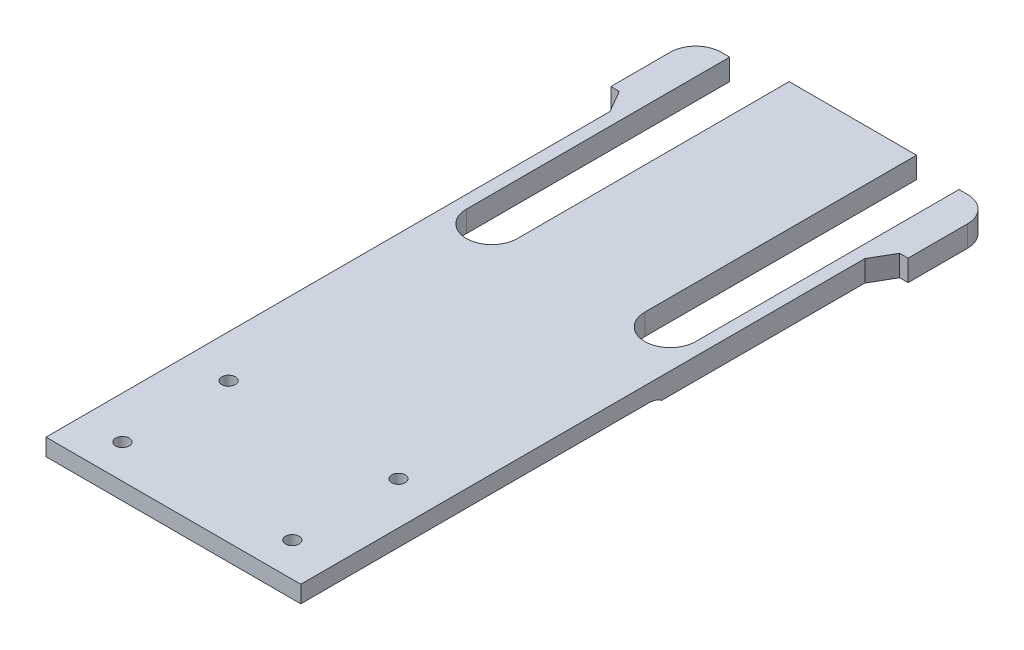
ISO-10303-21;
HEADER;
FILE_DESCRIPTION(('STEP AP214'),'2;1');
FILE_NAME('part.step','',(''),(''),'','','');
FILE_SCHEMA(('AUTOMOTIVE_DESIGN { 1 0 10303 214 1 1 1 1 }'));
ENDSEC;
DATA;
#1=APPLICATION_CONTEXT('core data for automotive mechanical design processes');
#2=APPLICATION_PROTOCOL_DEFINITION('international standard','automotive_design',2000,#1);
#3=PRODUCT_CONTEXT('',#1,'mechanical');
#4=PRODUCT('Part','Part','',(#3));
#5=PRODUCT_RELATED_PRODUCT_CATEGORY('part','',(#4));
#6=PRODUCT_DEFINITION_FORMATION('','',#4);
#7=PRODUCT_DEFINITION_CONTEXT('part definition',#1,'design');
#8=PRODUCT_DEFINITION('design','',#6,#7);
#9=PRODUCT_DEFINITION_SHAPE('','',#8);
#10=(LENGTH_UNIT() NAMED_UNIT(*) SI_UNIT(.MILLI.,.METRE.));
#11=(NAMED_UNIT(*) PLANE_ANGLE_UNIT() SI_UNIT($,.RADIAN.));
#12=(NAMED_UNIT(*) SI_UNIT($,.STERADIAN.) SOLID_ANGLE_UNIT());
#13=UNCERTAINTY_MEASURE_WITH_UNIT(LENGTH_MEASURE(1.E-05),#10,'distance_accuracy_value','');
#14=(GEOMETRIC_REPRESENTATION_CONTEXT(3) GLOBAL_UNCERTAINTY_ASSIGNED_CONTEXT((#13)) GLOBAL_UNIT_ASSIGNED_CONTEXT((#10,
#11,#12)) REPRESENTATION_CONTEXT('',''));
#15=CARTESIAN_POINT('',(0.,0.,0.));
#16=DIRECTION('',(0.,0.,1.));
#17=DIRECTION('',(1.,0.,0.));
#18=AXIS2_PLACEMENT_3D('',#15,#16,#17);
#19=CARTESIAN_POINT('',(30.,5.,22.));
#20=DIRECTION('',(-1.,0.,0.));
#21=DIRECTION('',(0.,0.,1.));
#22=AXIS2_PLACEMENT_3D('',#19,#20,#21);
#23=PLANE('',#22);
#24=DIRECTION('',(0.,0.,1.));
#25=VECTOR('',#24,1.);
#26=CARTESIAN_POINT('',(30.0000000000001,1.,160.));
#27=LINE('',#26,#25);
#28=CARTESIAN_POINT('',(30.,0.99999999999999,78.));
#29=VERTEX_POINT('',#28);
#30=CARTESIAN_POINT('',(30.0000000000001,1.,160.));
#31=VERTEX_POINT('',#30);
#32=EDGE_CURVE('E203',#29,#31,#27,.T.);
#33=ORIENTED_EDGE('',*,*,#32,.F.);
#34=CARTESIAN_POINT('',(30.,-4.00000000000001,78.));
#35=DIRECTION('',(-1.,0.,0.));
#36=DIRECTION('',(0.,0.,1.));
#37=AXIS2_PLACEMENT_3D('',#34,#35,#36);
#38=CIRCLE('',#37,5.);
#39=CARTESIAN_POINT('',(30.,0.,75.));
#40=VERTEX_POINT('',#39);
#41=EDGE_CURVE('E11',#29,#40,#38,.T.);
#42=ORIENTED_EDGE('',*,*,#41,.T.);
#43=DIRECTION('',(0.,0.,-1.));
#44=VECTOR('',#43,1.);
#45=CARTESIAN_POINT('',(30.,0.,22.));
#46=LINE('',#45,#44);
#47=CARTESIAN_POINT('',(30.,0.,27.1961524227067));
#48=VERTEX_POINT('',#47);
#49=EDGE_CURVE('E335',#40,#48,#46,.T.);
#50=ORIENTED_EDGE('',*,*,#49,.T.);
#51=DIRECTION('',(0.,1.,0.));
#52=VECTOR('',#51,1.);
#53=CARTESIAN_POINT('',(30.,5.,27.1961524227067));
#54=LINE('',#53,#52);
#55=CARTESIAN_POINT('',(30.,5.,27.1961524227067));
#56=VERTEX_POINT('',#55);
#57=EDGE_CURVE('E357',#48,#56,#54,.T.);
#58=ORIENTED_EDGE('',*,*,#57,.T.);
#59=DIRECTION('',(0.,0.,-1.));
#60=VECTOR('',#59,1.);
#61=CARTESIAN_POINT('',(30.,5.,22.));
#62=LINE('',#61,#60);
#63=CARTESIAN_POINT('',(30.0000000000001,5.,160.));
#64=VERTEX_POINT('',#63);
#65=EDGE_CURVE('E229',#64,#56,#62,.T.);
#66=ORIENTED_EDGE('',*,*,#65,.F.);
#67=DIRECTION('',(0.,-1.,0.));
#68=VECTOR('',#67,1.);
#69=CARTESIAN_POINT('',(30.0000000000001,5.,160.));
#70=LINE('',#69,#68);
#71=EDGE_CURVE('E220',#64,#31,#70,.T.);
#72=ORIENTED_EDGE('',*,*,#71,.T.);
#73=EDGE_LOOP('',(#33,#42,#50,#58,#66,#72));
#74=FACE_BOUND('',#73,.T.);
#75=ADVANCED_FACE('F45',(#74),#23,.F.);
#76=CARTESIAN_POINT('',(35.,5.,22.));
#77=DIRECTION('',(0.,0.,-1.));
#78=DIRECTION('',(-1.,0.,0.));
#79=AXIS2_PLACEMENT_3D('',#76,#77,#78);
#80=PLANE('',#79);
#81=DIRECTION('',(1.,0.,0.));
#82=VECTOR('',#81,1.);
#83=CARTESIAN_POINT('',(35.,5.,22.));
#84=LINE('',#83,#82);
#85=CARTESIAN_POINT('',(33.,5.,22.));
#86=VERTEX_POINT('',#85);
#87=CARTESIAN_POINT('',(35.,5.,22.));
#88=VERTEX_POINT('',#87);
#89=EDGE_CURVE('E375',#86,#88,#84,.T.);
#90=ORIENTED_EDGE('',*,*,#89,.F.);
#91=DIRECTION('',(0.,-1.,0.));
#92=VECTOR('',#91,1.);
#93=CARTESIAN_POINT('',(33.,0.,22.));
#94=LINE('',#93,#92);
#95=CARTESIAN_POINT('',(33.,0.,22.));
#96=VERTEX_POINT('',#95);
#97=EDGE_CURVE('E353',#86,#96,#94,.T.);
#98=ORIENTED_EDGE('',*,*,#97,.T.);
#99=DIRECTION('',(1.,0.,0.));
#100=VECTOR('',#99,1.);
#101=CARTESIAN_POINT('',(35.,0.,22.));
#102=LINE('',#101,#100);
#103=CARTESIAN_POINT('',(35.,0.,22.));
#104=VERTEX_POINT('',#103);
#105=EDGE_CURVE('E394',#96,#104,#102,.T.);
#106=ORIENTED_EDGE('',*,*,#105,.T.);
#107=DIRECTION('',(0.,-1.,0.));
#108=VECTOR('',#107,1.);
#109=CARTESIAN_POINT('',(35.,5.,22.));
#110=LINE('',#109,#108);
#111=EDGE_CURVE('E262',#88,#104,#110,.T.);
#112=ORIENTED_EDGE('',*,*,#111,.F.);
#113=EDGE_LOOP('',(#90,#98,#106,#112));
#114=FACE_BOUND('',#113,.T.);
#115=ADVANCED_FACE('F381',(#114),#80,.F.);
#116=CARTESIAN_POINT('',(35.,5.,1.99999999999998));
#117=DIRECTION('',(-1.,0.,0.));
#118=DIRECTION('',(0.,0.,1.));
#119=AXIS2_PLACEMENT_3D('',#116,#117,#118);
#120=PLANE('',#119);
#121=DIRECTION('',(0.,0.,-1.));
#122=VECTOR('',#121,1.);
#123=CARTESIAN_POINT('',(35.,0.,1.99999999999998));
#124=LINE('',#123,#122);
#125=CARTESIAN_POINT('',(35.,0.,7.99999999999999));
#126=VERTEX_POINT('',#125);
#127=EDGE_CURVE('E396',#104,#126,#124,.T.);
#128=ORIENTED_EDGE('',*,*,#127,.T.);
#129=DIRECTION('',(0.,-1.,0.));
#130=VECTOR('',#129,1.);
#131=CARTESIAN_POINT('',(35.,5.,7.99999999999999));
#132=LINE('',#131,#130);
#133=CARTESIAN_POINT('',(35.,5.,7.99999999999999));
#134=VERTEX_POINT('',#133);
#135=EDGE_CURVE('E289',#126,#134,#132,.F.);
#136=ORIENTED_EDGE('',*,*,#135,.T.);
#137=DIRECTION('',(0.,0.,-1.));
#138=VECTOR('',#137,1.);
#139=CARTESIAN_POINT('',(35.,5.,1.99999999999998));
#140=LINE('',#139,#138);
#141=EDGE_CURVE('E385',#88,#134,#140,.T.);
#142=ORIENTED_EDGE('',*,*,#141,.F.);
#143=ORIENTED_EDGE('',*,*,#111,.T.);
#144=EDGE_LOOP('',(#128,#136,#142,#143));
#145=FACE_BOUND('',#144,.T.);
#146=ADVANCED_FACE('F542',(#145),#120,.F.);
#147=CARTESIAN_POINT('',(27.,5.,1.99999999999999));
#148=DIRECTION('',(0.,0.,1.));
#149=DIRECTION('',(1.,0.,0.));
#150=AXIS2_PLACEMENT_3D('',#147,#148,#149);
#151=PLANE('',#150);
#152=DIRECTION('',(-1.,0.,0.));
#153=VECTOR('',#152,1.);
#154=CARTESIAN_POINT('',(27.,5.,1.99999999999999));
#155=LINE('',#154,#153);
#156=CARTESIAN_POINT('',(29.,5.,1.99999999999999));
#157=VERTEX_POINT('',#156);
#158=CARTESIAN_POINT('',(27.,5.,1.99999999999999));
#159=VERTEX_POINT('',#158);
#160=EDGE_CURVE('E445',#157,#159,#155,.T.);
#161=ORIENTED_EDGE('',*,*,#160,.F.);
#162=DIRECTION('',(0.,-1.,0.));
#163=VECTOR('',#162,1.);
#164=CARTESIAN_POINT('',(29.,5.,1.99999999999999));
#165=LINE('',#164,#163);
#166=CARTESIAN_POINT('',(29.,0.,1.99999999999999));
#167=VERTEX_POINT('',#166);
#168=EDGE_CURVE('E285',#157,#167,#165,.T.);
#169=ORIENTED_EDGE('',*,*,#168,.T.);
#170=DIRECTION('',(-1.,0.,0.));
#171=VECTOR('',#170,1.);
#172=CARTESIAN_POINT('',(27.,0.,1.99999999999999));
#173=LINE('',#172,#171);
#174=CARTESIAN_POINT('',(27.,0.,1.99999999999999));
#175=VERTEX_POINT('',#174);
#176=EDGE_CURVE('E401',#167,#175,#173,.T.);
#177=ORIENTED_EDGE('',*,*,#176,.T.);
#178=DIRECTION('',(0.,-1.,0.));
#179=VECTOR('',#178,1.);
#180=CARTESIAN_POINT('',(27.,5.,1.99999999999999));
#181=LINE('',#180,#179);
#182=EDGE_CURVE('E258',#159,#175,#181,.T.);
#183=ORIENTED_EDGE('',*,*,#182,.F.);
#184=EDGE_LOOP('',(#161,#169,#177,#183));
#185=FACE_BOUND('',#184,.T.);
#186=ADVANCED_FACE('F802',(#185),#151,.F.);
#187=CARTESIAN_POINT('',(27.,5.,70.));
#188=DIRECTION('',(1.,0.,0.));
#189=DIRECTION('',(0.,0.,-1.));
#190=AXIS2_PLACEMENT_3D('',#187,#188,#189);
#191=PLANE('',#190);
#192=DIRECTION('',(0.,0.,1.));
#193=VECTOR('',#192,1.);
#194=CARTESIAN_POINT('',(27.,0.,70.));
#195=LINE('',#194,#193);
#196=CARTESIAN_POINT('',(27.,0.,64.));
#197=VERTEX_POINT('',#196);
#198=EDGE_CURVE('E407',#175,#197,#195,.T.);
#199=ORIENTED_EDGE('',*,*,#198,.T.);
#200=DIRECTION('',(0.,-1.,0.));
#201=VECTOR('',#200,1.);
#202=CARTESIAN_POINT('',(27.,5.,64.));
#203=LINE('',#202,#201);
#204=CARTESIAN_POINT('',(27.,5.,64.));
#205=VERTEX_POINT('',#204);
#206=EDGE_CURVE('E303',#197,#205,#203,.F.);
#207=ORIENTED_EDGE('',*,*,#206,.T.);
#208=DIRECTION('',(0.,0.,1.));
#209=VECTOR('',#208,1.);
#210=CARTESIAN_POINT('',(27.,5.,70.));
#211=LINE('',#210,#209);
#212=EDGE_CURVE('E448',#159,#205,#211,.T.);
#213=ORIENTED_EDGE('',*,*,#212,.F.);
#214=ORIENTED_EDGE('',*,*,#182,.T.);
#215=EDGE_LOOP('',(#199,#207,#213,#214));
#216=FACE_BOUND('',#215,.T.);
#217=ADVANCED_FACE('F792',(#216),#191,.F.);
#218=CARTESIAN_POINT('',(15.,5.,0.));
#219=DIRECTION('',(-1.,0.,0.));
#220=DIRECTION('',(0.,0.,1.));
#221=AXIS2_PLACEMENT_3D('',#218,#219,#220);
#222=PLANE('',#221);
#223=DIRECTION('',(0.,0.,-1.));
#224=VECTOR('',#223,1.);
#225=CARTESIAN_POINT('',(15.,5.,0.));
#226=LINE('',#225,#224);
#227=CARTESIAN_POINT('',(15.,5.,64.));
#228=VERTEX_POINT('',#227);
#229=CARTESIAN_POINT('',(15.,5.,0.));
#230=VERTEX_POINT('',#229);
#231=EDGE_CURVE('E452',#228,#230,#226,.T.);
#232=ORIENTED_EDGE('',*,*,#231,.F.);
#233=DIRECTION('',(0.,-1.,0.));
#234=VECTOR('',#233,1.);
#235=CARTESIAN_POINT('',(15.,0.,64.));
#236=LINE('',#235,#234);
#237=CARTESIAN_POINT('',(15.,0.,64.));
#238=VERTEX_POINT('',#237);
#239=EDGE_CURVE('E299',#228,#238,#236,.T.);
#240=ORIENTED_EDGE('',*,*,#239,.T.);
#241=DIRECTION('',(0.,0.,-1.));
#242=VECTOR('',#241,1.);
#243=CARTESIAN_POINT('',(15.,0.,0.));
#244=LINE('',#243,#242);
#245=CARTESIAN_POINT('',(15.,0.,0.));
#246=VERTEX_POINT('',#245);
#247=EDGE_CURVE('E411',#238,#246,#244,.T.);
#248=ORIENTED_EDGE('',*,*,#247,.T.);
#249=DIRECTION('',(0.,-1.,0.));
#250=VECTOR('',#249,1.);
#251=CARTESIAN_POINT('',(15.,5.,0.));
#252=LINE('',#251,#250);
#253=EDGE_CURVE('E254',#230,#246,#252,.T.);
#254=ORIENTED_EDGE('',*,*,#253,.F.);
#255=EDGE_LOOP('',(#232,#240,#248,#254));
#256=FACE_BOUND('',#255,.T.);
#257=ADVANCED_FACE('F782',(#256),#222,.F.);
#258=CARTESIAN_POINT('',(15.,5.,0.));
#259=DIRECTION('',(0.,0.,1.));
#260=DIRECTION('',(1.,0.,0.));
#261=AXIS2_PLACEMENT_3D('',#258,#259,#260);
#262=PLANE('',#261);
#263=DIRECTION('',(-1.,0.,0.));
#264=VECTOR('',#263,1.);
#265=CARTESIAN_POINT('',(15.,0.,0.));
#266=LINE('',#265,#264);
#267=CARTESIAN_POINT('',(-15.,0.,0.));
#268=VERTEX_POINT('',#267);
#269=EDGE_CURVE('E414',#246,#268,#266,.T.);
#270=ORIENTED_EDGE('',*,*,#269,.T.);
#271=DIRECTION('',(0.,-1.,0.));
#272=VECTOR('',#271,1.);
#273=CARTESIAN_POINT('',(-15.,5.,0.));
#274=LINE('',#273,#272);
#275=CARTESIAN_POINT('',(-15.,5.,0.));
#276=VERTEX_POINT('',#275);
#277=EDGE_CURVE('E250',#276,#268,#274,.T.);
#278=ORIENTED_EDGE('',*,*,#277,.F.);
#279=DIRECTION('',(-1.,0.,0.));
#280=VECTOR('',#279,1.);
#281=CARTESIAN_POINT('',(15.,5.,0.));
#282=LINE('',#281,#280);
#283=EDGE_CURVE('E455',#230,#276,#282,.T.);
#284=ORIENTED_EDGE('',*,*,#283,.F.);
#285=ORIENTED_EDGE('',*,*,#253,.T.);
#286=EDGE_LOOP('',(#270,#278,#284,#285));
#287=FACE_BOUND('',#286,.T.);
#288=ADVANCED_FACE('F772',(#287),#262,.F.);
#289=CARTESIAN_POINT('',(-15.,5.,0.));
#290=DIRECTION('',(1.,0.,0.));
#291=DIRECTION('',(0.,0.,-1.));
#292=AXIS2_PLACEMENT_3D('',#289,#290,#291);
#293=PLANE('',#292);
#294=DIRECTION('',(0.,0.,1.));
#295=VECTOR('',#294,1.);
#296=CARTESIAN_POINT('',(-15.,0.,0.));
#297=LINE('',#296,#295);
#298=CARTESIAN_POINT('',(-15.,0.,64.));
#299=VERTEX_POINT('',#298);
#300=EDGE_CURVE('E417',#268,#299,#297,.T.);
#301=ORIENTED_EDGE('',*,*,#300,.T.);
#302=DIRECTION('',(0.,-1.,0.));
#303=VECTOR('',#302,1.);
#304=CARTESIAN_POINT('',(-15.,5.,64.));
#305=LINE('',#304,#303);
#306=CARTESIAN_POINT('',(-15.,5.,64.));
#307=VERTEX_POINT('',#306);
#308=EDGE_CURVE('E296',#299,#307,#305,.F.);
#309=ORIENTED_EDGE('',*,*,#308,.T.);
#310=DIRECTION('',(0.,0.,1.));
#311=VECTOR('',#310,1.);
#312=CARTESIAN_POINT('',(-15.,5.,0.));
#313=LINE('',#312,#311);
#314=EDGE_CURVE('E458',#276,#307,#313,.T.);
#315=ORIENTED_EDGE('',*,*,#314,.F.);
#316=ORIENTED_EDGE('',*,*,#277,.T.);
#317=EDGE_LOOP('',(#301,#309,#315,#316));
#318=FACE_BOUND('',#317,.T.);
#319=ADVANCED_FACE('F762',(#318),#293,.F.);
#320=CARTESIAN_POINT('',(-27.,5.,70.));
#321=DIRECTION('',(-1.,0.,0.));
#322=DIRECTION('',(0.,0.,1.));
#323=AXIS2_PLACEMENT_3D('',#320,#321,#322);
#324=PLANE('',#323);
#325=DIRECTION('',(0.,0.,-1.));
#326=VECTOR('',#325,1.);
#327=CARTESIAN_POINT('',(-27.,5.,70.));
#328=LINE('',#327,#326);
#329=CARTESIAN_POINT('',(-27.,5.,64.));
#330=VERTEX_POINT('',#329);
#331=CARTESIAN_POINT('',(-27.,5.,1.99999999999999));
#332=VERTEX_POINT('',#331);
#333=EDGE_CURVE('E462',#330,#332,#328,.T.);
#334=ORIENTED_EDGE('',*,*,#333,.F.);
#335=DIRECTION('',(0.,-1.,0.));
#336=VECTOR('',#335,1.);
#337=CARTESIAN_POINT('',(-27.,0.,64.));
#338=LINE('',#337,#336);
#339=CARTESIAN_POINT('',(-27.,0.,64.));
#340=VERTEX_POINT('',#339);
#341=EDGE_CURVE('E292',#330,#340,#338,.T.);
#342=ORIENTED_EDGE('',*,*,#341,.T.);
#343=DIRECTION('',(0.,0.,-1.));
#344=VECTOR('',#343,1.);
#345=CARTESIAN_POINT('',(-27.,0.,70.));
#346=LINE('',#345,#344);
#347=CARTESIAN_POINT('',(-27.,0.,1.99999999999999));
#348=VERTEX_POINT('',#347);
#349=EDGE_CURVE('E421',#340,#348,#346,.T.);
#350=ORIENTED_EDGE('',*,*,#349,.T.);
#351=DIRECTION('',(0.,-1.,0.));
#352=VECTOR('',#351,1.);
#353=CARTESIAN_POINT('',(-27.,5.,1.99999999999999));
#354=LINE('',#353,#352);
#355=EDGE_CURVE('E246',#332,#348,#354,.T.);
#356=ORIENTED_EDGE('',*,*,#355,.F.);
#357=EDGE_LOOP('',(#334,#342,#350,#356));
#358=FACE_BOUND('',#357,.T.);
#359=ADVANCED_FACE('F752',(#358),#324,.F.);
#360=CARTESIAN_POINT('',(-27.,5.,1.99999999999999));
#361=DIRECTION('',(0.,0.,1.));
#362=DIRECTION('',(1.,0.,0.));
#363=AXIS2_PLACEMENT_3D('',#360,#361,#362);
#364=PLANE('',#363);
#365=DIRECTION('',(-1.,0.,0.));
#366=VECTOR('',#365,1.);
#367=CARTESIAN_POINT('',(-27.,0.,1.99999999999999));
#368=LINE('',#367,#366);
#369=CARTESIAN_POINT('',(-29.,0.,1.99999999999999));
#370=VERTEX_POINT('',#369);
#371=EDGE_CURVE('E424',#348,#370,#368,.T.);
#372=ORIENTED_EDGE('',*,*,#371,.T.);
#373=DIRECTION('',(0.,-1.,0.));
#374=VECTOR('',#373,1.);
#375=CARTESIAN_POINT('',(-29.,5.,1.99999999999999));
#376=LINE('',#375,#374);
#377=CARTESIAN_POINT('',(-29.,5.,1.99999999999999));
#378=VERTEX_POINT('',#377);
#379=EDGE_CURVE('E276',#370,#378,#376,.F.);
#380=ORIENTED_EDGE('',*,*,#379,.T.);
#381=DIRECTION('',(-1.,0.,0.));
#382=VECTOR('',#381,1.);
#383=CARTESIAN_POINT('',(-27.,5.,1.99999999999999));
#384=LINE('',#383,#382);
#385=EDGE_CURVE('E465',#332,#378,#384,.T.);
#386=ORIENTED_EDGE('',*,*,#385,.F.);
#387=ORIENTED_EDGE('',*,*,#355,.T.);
#388=EDGE_LOOP('',(#372,#380,#386,#387));
#389=FACE_BOUND('',#388,.T.);
#390=ADVANCED_FACE('F742',(#389),#364,.F.);
#391=CARTESIAN_POINT('',(-35.,5.,1.99999999999999));
#392=DIRECTION('',(1.,0.,0.));
#393=DIRECTION('',(0.,0.,-1.));
#394=AXIS2_PLACEMENT_3D('',#391,#392,#393);
#395=PLANE('',#394);
#396=DIRECTION('',(0.,0.,1.));
#397=VECTOR('',#396,1.);
#398=CARTESIAN_POINT('',(-35.,5.,1.99999999999999));
#399=LINE('',#398,#397);
#400=CARTESIAN_POINT('',(-35.,5.,7.99999999999999));
#401=VERTEX_POINT('',#400);
#402=CARTESIAN_POINT('',(-35.,5.,22.));
#403=VERTEX_POINT('',#402);
#404=EDGE_CURVE('E468',#401,#403,#399,.T.);
#405=ORIENTED_EDGE('',*,*,#404,.F.);
#406=DIRECTION('',(0.,-1.,0.));
#407=VECTOR('',#406,1.);
#408=CARTESIAN_POINT('',(-35.,5.,7.99999999999999));
#409=LINE('',#408,#407);
#410=CARTESIAN_POINT('',(-35.,0.,7.99999999999999));
#411=VERTEX_POINT('',#410);
#412=EDGE_CURVE('E266',#401,#411,#409,.T.);
#413=ORIENTED_EDGE('',*,*,#412,.T.);
#414=DIRECTION('',(0.,0.,1.));
#415=VECTOR('',#414,1.);
#416=CARTESIAN_POINT('',(-35.,0.,1.99999999999999));
#417=LINE('',#416,#415);
#418=CARTESIAN_POINT('',(-35.,0.,22.));
#419=VERTEX_POINT('',#418);
#420=EDGE_CURVE('E428',#411,#419,#417,.T.);
#421=ORIENTED_EDGE('',*,*,#420,.T.);
#422=DIRECTION('',(0.,-1.,0.));
#423=VECTOR('',#422,1.);
#424=CARTESIAN_POINT('',(-35.,5.,22.));
#425=LINE('',#424,#423);
#426=EDGE_CURVE('E235',#403,#419,#425,.T.);
#427=ORIENTED_EDGE('',*,*,#426,.F.);
#428=EDGE_LOOP('',(#405,#413,#421,#427));
#429=FACE_BOUND('',#428,.T.);
#430=ADVANCED_FACE('F733',(#429),#395,.F.);
#431=CARTESIAN_POINT('',(-35.,5.,22.));
#432=DIRECTION('',(0.,0.,-1.));
#433=DIRECTION('',(-1.,0.,0.));
#434=AXIS2_PLACEMENT_3D('',#431,#432,#433);
#435=PLANE('',#434);
#436=DIRECTION('',(1.,0.,0.));
#437=VECTOR('',#436,1.);
#438=CARTESIAN_POINT('',(-35.,0.,22.));
#439=LINE('',#438,#437);
#440=CARTESIAN_POINT('',(-33.,0.,22.));
#441=VERTEX_POINT('',#440);
#442=EDGE_CURVE('E430',#419,#441,#439,.T.);
#443=ORIENTED_EDGE('',*,*,#442,.T.);
#444=DIRECTION('',(0.,1.,0.));
#445=VECTOR('',#444,1.);
#446=CARTESIAN_POINT('',(-33.,5.,22.));
#447=LINE('',#446,#445);
#448=CARTESIAN_POINT('',(-33.,5.,22.));
#449=VERTEX_POINT('',#448);
#450=EDGE_CURVE('E344',#441,#449,#447,.T.);
#451=ORIENTED_EDGE('',*,*,#450,.T.);
#452=DIRECTION('',(1.,0.,0.));
#453=VECTOR('',#452,1.);
#454=CARTESIAN_POINT('',(-35.,5.,22.));
#455=LINE('',#454,#453);
#456=EDGE_CURVE('E471',#403,#449,#455,.T.);
#457=ORIENTED_EDGE('',*,*,#456,.F.);
#458=ORIENTED_EDGE('',*,*,#426,.T.);
#459=EDGE_LOOP('',(#443,#451,#457,#458));
#460=FACE_BOUND('',#459,.T.);
#461=ADVANCED_FACE('F625',(#460),#435,.F.);
#462=CARTESIAN_POINT('',(-30.,5.,22.));
#463=DIRECTION('',(1.,0.,0.));
#464=DIRECTION('',(0.,0.,-1.));
#465=AXIS2_PLACEMENT_3D('',#462,#463,#464);
#466=PLANE('',#465);
#467=DIRECTION('',(0.,0.,1.));
#468=VECTOR('',#467,1.);
#469=CARTESIAN_POINT('',(-30.,0.,22.));
#470=LINE('',#469,#468);
#471=CARTESIAN_POINT('',(-30.,0.,27.1961524227067));
#472=VERTEX_POINT('',#471);
#473=CARTESIAN_POINT('',(-30.,0.,75.));
#474=VERTEX_POINT('',#473);
#475=EDGE_CURVE('E240',#472,#474,#470,.T.);
#476=ORIENTED_EDGE('',*,*,#475,.T.);
#477=CARTESIAN_POINT('',(-30.,-4.00000000000001,78.));
#478=DIRECTION('',(1.,0.,0.));
#479=DIRECTION('',(0.,0.,-1.));
#480=AXIS2_PLACEMENT_3D('',#477,#478,#479);
#481=CIRCLE('',#480,5.);
#482=CARTESIAN_POINT('',(-30.,0.99999999999999,78.));
#483=VERTEX_POINT('',#482);
#484=EDGE_CURVE('E54',#474,#483,#481,.T.);
#485=ORIENTED_EDGE('',*,*,#484,.T.);
#486=DIRECTION('',(0.,0.,-1.));
#487=VECTOR('',#486,1.);
#488=CARTESIAN_POINT('',(-30.,1.,160.));
#489=LINE('',#488,#487);
#490=CARTESIAN_POINT('',(-30.,1.,160.));
#491=VERTEX_POINT('',#490);
#492=EDGE_CURVE('E226',#491,#483,#489,.T.);
#493=ORIENTED_EDGE('',*,*,#492,.F.);
#494=DIRECTION('',(0.,-1.,0.));
#495=VECTOR('',#494,1.);
#496=CARTESIAN_POINT('',(-30.,5.,160.));
#497=LINE('',#496,#495);
#498=CARTESIAN_POINT('',(-30.,5.,160.));
#499=VERTEX_POINT('',#498);
#500=EDGE_CURVE('E223',#499,#491,#497,.T.);
#501=ORIENTED_EDGE('',*,*,#500,.F.);
#502=DIRECTION('',(0.,0.,1.));
#503=VECTOR('',#502,1.);
#504=CARTESIAN_POINT('',(-30.,5.,22.));
#505=LINE('',#504,#503);
#506=CARTESIAN_POINT('',(-30.,5.,27.1961524227067));
#507=VERTEX_POINT('',#506);
#508=EDGE_CURVE('E237',#507,#499,#505,.T.);
#509=ORIENTED_EDGE('',*,*,#508,.F.);
#510=DIRECTION('',(0.,-1.,0.));
#511=VECTOR('',#510,1.);
#512=CARTESIAN_POINT('',(-30.,0.,27.1961524227067));
#513=LINE('',#512,#511);
#514=EDGE_CURVE('E330',#507,#472,#513,.T.);
#515=ORIENTED_EDGE('',*,*,#514,.T.);
#516=EDGE_LOOP('',(#476,#485,#493,#501,#509,#515));
#517=FACE_BOUND('',#516,.T.);
#518=ADVANCED_FACE('F479',(#517),#466,.F.);
#519=CARTESIAN_POINT('',(-30.,5.,160.));
#520=DIRECTION('',(0.,0.,-1.));
#521=DIRECTION('',(-1.,0.,0.));
#522=AXIS2_PLACEMENT_3D('',#519,#520,#521);
#523=PLANE('',#522);
#524=ORIENTED_EDGE('',*,*,#500,.T.);
#525=DIRECTION('',(-1.,0.,0.));
#526=VECTOR('',#525,1.);
#527=CARTESIAN_POINT('',(35.001,1.,160.));
#528=LINE('',#527,#526);
#529=EDGE_CURVE('E207',#31,#491,#528,.T.);
#530=ORIENTED_EDGE('',*,*,#529,.F.);
#531=ORIENTED_EDGE('',*,*,#71,.F.);
#532=DIRECTION('',(1.,0.,0.));
#533=VECTOR('',#532,1.);
#534=CARTESIAN_POINT('',(-30.,5.,160.));
#535=LINE('',#534,#533);
#536=EDGE_CURVE('E231',#499,#64,#535,.T.);
#537=ORIENTED_EDGE('',*,*,#536,.F.);
#538=EDGE_LOOP('',(#524,#530,#531,#537));
#539=FACE_BOUND('',#538,.T.);
#540=ADVANCED_FACE('F218',(#539),#523,.F.);
#541=CARTESIAN_POINT('',(0.,5.,0.));
#542=DIRECTION('',(0.,1.,0.));
#543=DIRECTION('',(0.,0.,1.));
#544=AXIS2_PLACEMENT_3D('',#541,#542,#543);
#545=PLANE('',#544);
#546=CARTESIAN_POINT('',(20.,5.,152.));
#547=DIRECTION('',(0.,1.,0.));
#548=DIRECTION('',(0.,0.,-1.));
#549=AXIS2_PLACEMENT_3D('',#546,#547,#548);
#550=CIRCLE('',#549,1.59999999999999);
#551=CARTESIAN_POINT('',(20.,5.,150.4));
#552=VERTEX_POINT('',#551);
#553=EDGE_CURVE('E504',#552,#552,#550,.T.);
#554=ORIENTED_EDGE('',*,*,#553,.F.);
#555=EDGE_LOOP('',(#554));
#556=FACE_BOUND('',#555,.T.);
#557=CARTESIAN_POINT('',(-20.,5.,127.));
#558=DIRECTION('',(0.,1.,0.));
#559=DIRECTION('',(0.,0.,1.));
#560=AXIS2_PLACEMENT_3D('',#557,#558,#559);
#561=CIRCLE('',#560,1.6);
#562=CARTESIAN_POINT('',(-20.,5.,128.6));
#563=VERTEX_POINT('',#562);
#564=EDGE_CURVE('E503',#563,#563,#561,.T.);
#565=ORIENTED_EDGE('',*,*,#564,.F.);
#566=EDGE_LOOP('',(#565));
#567=FACE_BOUND('',#566,.T.);
#568=CARTESIAN_POINT('',(20.,5.,127.));
#569=DIRECTION('',(0.,1.,0.));
#570=DIRECTION('',(0.,0.,-1.));
#571=AXIS2_PLACEMENT_3D('',#568,#569,#570);
#572=CIRCLE('',#571,1.6);
#573=CARTESIAN_POINT('',(20.,5.,125.4));
#574=VERTEX_POINT('',#573);
#575=EDGE_CURVE('E212',#574,#574,#572,.T.);
#576=ORIENTED_EDGE('',*,*,#575,.F.);
#577=EDGE_LOOP('',(#576));
#578=FACE_BOUND('',#577,.T.);
#579=CARTESIAN_POINT('',(-20.,5.,152.));
#580=DIRECTION('',(0.,1.,0.));
#581=DIRECTION('',(0.,0.,1.));
#582=AXIS2_PLACEMENT_3D('',#579,#580,#581);
#583=CIRCLE('',#582,1.59999999999999);
#584=CARTESIAN_POINT('',(-20.,5.,153.6));
#585=VERTEX_POINT('',#584);
#586=EDGE_CURVE('E340',#585,#585,#583,.T.);
#587=ORIENTED_EDGE('',*,*,#586,.F.);
#588=EDGE_LOOP('',(#587));
#589=FACE_BOUND('',#588,.T.);
#590=ORIENTED_EDGE('',*,*,#385,.T.);
#591=CARTESIAN_POINT('',(-29.,5.,7.99999999999999));
#592=DIRECTION('',(0.,1.,0.));
#593=DIRECTION('',(0.,0.,1.));
#594=AXIS2_PLACEMENT_3D('',#591,#592,#593);
#595=CIRCLE('',#594,6.);
#596=EDGE_CURVE('E282',#378,#401,#595,.T.);
#597=ORIENTED_EDGE('',*,*,#596,.T.);
#598=ORIENTED_EDGE('',*,*,#404,.T.);
#599=ORIENTED_EDGE('',*,*,#456,.T.);
#600=DIRECTION('',(-0.499999999999995,0.,-0.866025403784442));
#601=VECTOR('',#600,1.);
#602=CARTESIAN_POINT('',(-30.,5.,27.1961524227067));
#603=LINE('',#602,#601);
#604=EDGE_CURVE('E350',#449,#507,#603,.F.);
#605=ORIENTED_EDGE('',*,*,#604,.T.);
#606=ORIENTED_EDGE('',*,*,#508,.T.);
#607=ORIENTED_EDGE('',*,*,#536,.T.);
#608=ORIENTED_EDGE('',*,*,#65,.T.);
#609=DIRECTION('',(-0.499999999999992,0.,0.866025403784443));
#610=VECTOR('',#609,1.);
#611=CARTESIAN_POINT('',(33.,5.,22.));
#612=LINE('',#611,#610);
#613=EDGE_CURVE('E364',#56,#86,#612,.F.);
#614=ORIENTED_EDGE('',*,*,#613,.T.);
#615=ORIENTED_EDGE('',*,*,#89,.T.);
#616=ORIENTED_EDGE('',*,*,#141,.T.);
#617=CARTESIAN_POINT('',(29.,5.,7.99999999999999));
#618=DIRECTION('',(0.,1.,0.));
#619=DIRECTION('',(0.,0.,1.));
#620=AXIS2_PLACEMENT_3D('',#617,#618,#619);
#621=CIRCLE('',#620,6.);
#622=EDGE_CURVE('E279',#134,#157,#621,.T.);
#623=ORIENTED_EDGE('',*,*,#622,.T.);
#624=ORIENTED_EDGE('',*,*,#160,.T.);
#625=ORIENTED_EDGE('',*,*,#212,.T.);
#626=CARTESIAN_POINT('',(21.,5.,64.));
#627=DIRECTION('',(0.,1.,0.));
#628=DIRECTION('',(0.,0.,1.));
#629=AXIS2_PLACEMENT_3D('',#626,#627,#628);
#630=CIRCLE('',#629,6.);
#631=CARTESIAN_POINT('',(21.,5.,70.));
#632=VERTEX_POINT('',#631);
#633=EDGE_CURVE('E327',#205,#632,#630,.F.);
#634=ORIENTED_EDGE('',*,*,#633,.T.);
#635=CARTESIAN_POINT('',(21.,5.,64.));
#636=DIRECTION('',(0.,1.,0.));
#637=DIRECTION('',(0.,0.,1.));
#638=AXIS2_PLACEMENT_3D('',#635,#636,#637);
#639=CIRCLE('',#638,6.);
#640=EDGE_CURVE('E321',#632,#228,#639,.F.);
#641=ORIENTED_EDGE('',*,*,#640,.T.);
#642=ORIENTED_EDGE('',*,*,#231,.T.);
#643=ORIENTED_EDGE('',*,*,#283,.T.);
#644=ORIENTED_EDGE('',*,*,#314,.T.);
#645=CARTESIAN_POINT('',(-21.,5.,64.));
#646=DIRECTION('',(0.,1.,0.));
#647=DIRECTION('',(0.,0.,1.));
#648=AXIS2_PLACEMENT_3D('',#645,#646,#647);
#649=CIRCLE('',#648,6.);
#650=CARTESIAN_POINT('',(-21.,5.,70.));
#651=VERTEX_POINT('',#650);
#652=EDGE_CURVE('E315',#307,#651,#649,.F.);
#653=ORIENTED_EDGE('',*,*,#652,.T.);
#654=CARTESIAN_POINT('',(-21.,5.,64.));
#655=DIRECTION('',(0.,1.,0.));
#656=DIRECTION('',(0.,0.,1.));
#657=AXIS2_PLACEMENT_3D('',#654,#655,#656);
#658=CIRCLE('',#657,6.);
#659=EDGE_CURVE('E309',#651,#330,#658,.F.);
#660=ORIENTED_EDGE('',*,*,#659,.T.);
#661=ORIENTED_EDGE('',*,*,#333,.T.);
#662=EDGE_LOOP('',(#590,#597,#598,#599,#605,#606,#607,#608,#614,#615,#616,#623,#624,#625,#634,
#641,#642,#643,#644,#653,#660,#661));
#663=FACE_BOUND('',#662,.T.);
#664=ADVANCED_FACE('F373',(#556,#567,#578,#589,#663),#545,.T.);
#665=CARTESIAN_POINT('',(0.,0.,0.));
#666=DIRECTION('',(0.,1.,0.));
#667=DIRECTION('',(0.,0.,1.));
#668=AXIS2_PLACEMENT_3D('',#665,#666,#667);
#669=PLANE('',#668);
#670=ORIENTED_EDGE('',*,*,#49,.F.);
#671=DIRECTION('',(-1.,0.,0.));
#672=VECTOR('',#671,1.);
#673=CARTESIAN_POINT('',(35.001,0.,75.));
#674=LINE('',#673,#672);
#675=EDGE_CURVE('E225',#40,#474,#674,.T.);
#676=ORIENTED_EDGE('',*,*,#675,.T.);
#677=ORIENTED_EDGE('',*,*,#475,.F.);
#678=DIRECTION('',(0.499999999999995,0.,0.866025403784442));
#679=VECTOR('',#678,1.);
#680=CARTESIAN_POINT('',(-34.2762794416289,0.,19.789419162443));
#681=LINE('',#680,#679);
#682=EDGE_CURVE('E347',#472,#441,#681,.F.);
#683=ORIENTED_EDGE('',*,*,#682,.T.);
#684=ORIENTED_EDGE('',*,*,#442,.F.);
#685=ORIENTED_EDGE('',*,*,#420,.F.);
#686=CARTESIAN_POINT('',(-29.,0.,7.99999999999999));
#687=DIRECTION('',(0.,1.,0.));
#688=DIRECTION('',(0.,0.,1.));
#689=AXIS2_PLACEMENT_3D('',#686,#687,#688);
#690=CIRCLE('',#689,6.);
#691=EDGE_CURVE('E273',#411,#370,#690,.F.);
#692=ORIENTED_EDGE('',*,*,#691,.T.);
#693=ORIENTED_EDGE('',*,*,#371,.F.);
#694=ORIENTED_EDGE('',*,*,#349,.F.);
#695=CARTESIAN_POINT('',(-21.,0.,64.));
#696=DIRECTION('',(0.,1.,0.));
#697=DIRECTION('',(0.,0.,1.));
#698=AXIS2_PLACEMENT_3D('',#695,#696,#697);
#699=CIRCLE('',#698,6.);
#700=CARTESIAN_POINT('',(-21.,0.,70.));
#701=VERTEX_POINT('',#700);
#702=EDGE_CURVE('E306',#340,#701,#699,.T.);
#703=ORIENTED_EDGE('',*,*,#702,.T.);
#704=CARTESIAN_POINT('',(-21.,0.,64.));
#705=DIRECTION('',(0.,1.,0.));
#706=DIRECTION('',(0.,0.,1.));
#707=AXIS2_PLACEMENT_3D('',#704,#705,#706);
#708=CIRCLE('',#707,6.);
#709=EDGE_CURVE('E312',#701,#299,#708,.T.);
#710=ORIENTED_EDGE('',*,*,#709,.T.);
#711=ORIENTED_EDGE('',*,*,#300,.F.);
#712=ORIENTED_EDGE('',*,*,#269,.F.);
#713=ORIENTED_EDGE('',*,*,#247,.F.);
#714=CARTESIAN_POINT('',(21.,0.,64.));
#715=DIRECTION('',(0.,1.,0.));
#716=DIRECTION('',(0.,0.,1.));
#717=AXIS2_PLACEMENT_3D('',#714,#715,#716);
#718=CIRCLE('',#717,6.);
#719=CARTESIAN_POINT('',(21.,0.,70.));
#720=VERTEX_POINT('',#719);
#721=EDGE_CURVE('E318',#238,#720,#718,.T.);
#722=ORIENTED_EDGE('',*,*,#721,.T.);
#723=CARTESIAN_POINT('',(21.,0.,64.));
#724=DIRECTION('',(0.,1.,0.));
#725=DIRECTION('',(0.,0.,1.));
#726=AXIS2_PLACEMENT_3D('',#723,#724,#725);
#727=CIRCLE('',#726,6.);
#728=EDGE_CURVE('E324',#720,#197,#727,.T.);
#729=ORIENTED_EDGE('',*,*,#728,.T.);
#730=ORIENTED_EDGE('',*,*,#198,.F.);
#731=ORIENTED_EDGE('',*,*,#176,.F.);
#732=CARTESIAN_POINT('',(29.,0.,7.99999999999999));
#733=DIRECTION('',(0.,1.,0.));
#734=DIRECTION('',(0.,0.,1.));
#735=AXIS2_PLACEMENT_3D('',#732,#733,#734);
#736=CIRCLE('',#735,6.);
#737=EDGE_CURVE('E270',#167,#126,#736,.F.);
#738=ORIENTED_EDGE('',*,*,#737,.T.);
#739=ORIENTED_EDGE('',*,*,#127,.F.);
#740=ORIENTED_EDGE('',*,*,#105,.F.);
#741=DIRECTION('',(0.499999999999992,0.,-0.866025403784443));
#742=VECTOR('',#741,1.);
#743=CARTESIAN_POINT('',(34.276279441629,0.,19.7894191624429));
#744=LINE('',#743,#742);
#745=EDGE_CURVE('E360',#96,#48,#744,.F.);
#746=ORIENTED_EDGE('',*,*,#745,.T.);
#747=EDGE_LOOP('',(#670,#676,#677,#683,#684,#685,#692,#693,#694,#703,#710,#711,#712,#713,#722,
#729,#730,#731,#738,#739,#740,#746));
#748=FACE_BOUND('',#747,.T.);
#749=ADVANCED_FACE('F390',(#748),#669,.F.);
#750=CARTESIAN_POINT('',(-29.,5.,7.99999999999999));
#751=DIRECTION('',(0.,-1.,0.));
#752=DIRECTION('',(0.,0.,-1.));
#753=AXIS2_PLACEMENT_3D('',#750,#751,#752);
#754=CYLINDRICAL_SURFACE('',#753,6.);
#755=ORIENTED_EDGE('',*,*,#596,.F.);
#756=ORIENTED_EDGE('',*,*,#379,.F.);
#757=ORIENTED_EDGE('',*,*,#691,.F.);
#758=ORIENTED_EDGE('',*,*,#412,.F.);
#759=EDGE_LOOP('',(#755,#756,#757,#758));
#760=FACE_BOUND('',#759,.T.);
#761=ADVANCED_FACE('F546',(#760),#754,.T.);
#762=CARTESIAN_POINT('',(29.,5.,7.99999999999999));
#763=DIRECTION('',(0.,-1.,0.));
#764=DIRECTION('',(0.,0.,-1.));
#765=AXIS2_PLACEMENT_3D('',#762,#763,#764);
#766=CYLINDRICAL_SURFACE('',#765,6.);
#767=ORIENTED_EDGE('',*,*,#622,.F.);
#768=ORIENTED_EDGE('',*,*,#135,.F.);
#769=ORIENTED_EDGE('',*,*,#737,.F.);
#770=ORIENTED_EDGE('',*,*,#168,.F.);
#771=EDGE_LOOP('',(#767,#768,#769,#770));
#772=FACE_BOUND('',#771,.T.);
#773=ADVANCED_FACE('F549',(#772),#766,.T.);
#774=CARTESIAN_POINT('',(-21.,5.,64.));
#775=DIRECTION('',(0.,1.,0.));
#776=DIRECTION('',(0.,0.,1.));
#777=AXIS2_PLACEMENT_3D('',#774,#775,#776);
#778=CYLINDRICAL_SURFACE('',#777,6.);
#779=DIRECTION('',(0.,-1.,0.));
#780=VECTOR('',#779,1.);
#781=CARTESIAN_POINT('',(-21.,0.,70.));
#782=LINE('',#781,#780);
#783=EDGE_CURVE('E331',#651,#701,#782,.T.);
#784=ORIENTED_EDGE('',*,*,#783,.F.);
#785=ORIENTED_EDGE('',*,*,#652,.F.);
#786=ORIENTED_EDGE('',*,*,#308,.F.);
#787=ORIENTED_EDGE('',*,*,#709,.F.);
#788=EDGE_LOOP('',(#784,#785,#786,#787));
#789=FACE_BOUND('',#788,.T.);
#790=ADVANCED_FACE('F553',(#789),#778,.F.);
#791=CARTESIAN_POINT('',(-21.,5.,64.));
#792=DIRECTION('',(0.,1.,0.));
#793=DIRECTION('',(0.,0.,1.));
#794=AXIS2_PLACEMENT_3D('',#791,#792,#793);
#795=CYLINDRICAL_SURFACE('',#794,6.);
#796=ORIENTED_EDGE('',*,*,#659,.F.);
#797=ORIENTED_EDGE('',*,*,#783,.T.);
#798=ORIENTED_EDGE('',*,*,#702,.F.);
#799=ORIENTED_EDGE('',*,*,#341,.F.);
#800=EDGE_LOOP('',(#796,#797,#798,#799));
#801=FACE_BOUND('',#800,.T.);
#802=ADVANCED_FACE('F555',(#801),#795,.F.);
#803=CARTESIAN_POINT('',(21.,5.,64.));
#804=DIRECTION('',(0.,1.,0.));
#805=DIRECTION('',(0.,0.,1.));
#806=AXIS2_PLACEMENT_3D('',#803,#804,#805);
#807=CYLINDRICAL_SURFACE('',#806,6.);
#808=DIRECTION('',(0.,-1.,0.));
#809=VECTOR('',#808,1.);
#810=CARTESIAN_POINT('',(21.,0.,70.));
#811=LINE('',#810,#809);
#812=EDGE_CURVE('E336',#632,#720,#811,.T.);
#813=ORIENTED_EDGE('',*,*,#812,.F.);
#814=ORIENTED_EDGE('',*,*,#633,.F.);
#815=ORIENTED_EDGE('',*,*,#206,.F.);
#816=ORIENTED_EDGE('',*,*,#728,.F.);
#817=EDGE_LOOP('',(#813,#814,#815,#816));
#818=FACE_BOUND('',#817,.T.);
#819=ADVANCED_FACE('F558',(#818),#807,.F.);
#820=CARTESIAN_POINT('',(21.,5.,64.));
#821=DIRECTION('',(0.,1.,0.));
#822=DIRECTION('',(0.,0.,1.));
#823=AXIS2_PLACEMENT_3D('',#820,#821,#822);
#824=CYLINDRICAL_SURFACE('',#823,6.);
#825=ORIENTED_EDGE('',*,*,#640,.F.);
#826=ORIENTED_EDGE('',*,*,#812,.T.);
#827=ORIENTED_EDGE('',*,*,#721,.F.);
#828=ORIENTED_EDGE('',*,*,#239,.F.);
#829=EDGE_LOOP('',(#825,#826,#827,#828));
#830=FACE_BOUND('',#829,.T.);
#831=ADVANCED_FACE('F563',(#830),#824,.F.);
#832=CARTESIAN_POINT('',(-30.,5.,27.1961524227067));
#833=DIRECTION('',(-0.866025403784441,0.,0.499999999999995));
#834=DIRECTION('',(0.,1.,0.));
#835=AXIS2_PLACEMENT_3D('',#832,#833,#834);
#836=PLANE('',#835);
#837=ORIENTED_EDGE('',*,*,#604,.F.);
#838=ORIENTED_EDGE('',*,*,#450,.F.);
#839=ORIENTED_EDGE('',*,*,#682,.F.);
#840=ORIENTED_EDGE('',*,*,#514,.F.);
#841=EDGE_LOOP('',(#837,#838,#839,#840));
#842=FACE_BOUND('',#841,.T.);
#843=ADVANCED_FACE('F534',(#842),#836,.T.);
#844=CARTESIAN_POINT('',(33.,5.,22.));
#845=DIRECTION('',(0.866025403784443,0.,0.499999999999992));
#846=DIRECTION('',(0.,1.,0.));
#847=AXIS2_PLACEMENT_3D('',#844,#845,#846);
#848=PLANE('',#847);
#849=ORIENTED_EDGE('',*,*,#613,.F.);
#850=ORIENTED_EDGE('',*,*,#57,.F.);
#851=ORIENTED_EDGE('',*,*,#745,.F.);
#852=ORIENTED_EDGE('',*,*,#97,.F.);
#853=EDGE_LOOP('',(#849,#850,#851,#852));
#854=FACE_BOUND('',#853,.T.);
#855=ADVANCED_FACE('F387',(#854),#848,.T.);
#856=CARTESIAN_POINT('',(-20.,-0.00100000000000013,152.));
#857=DIRECTION('',(0.,1.,0.));
#858=DIRECTION('',(0.,0.,1.));
#859=AXIS2_PLACEMENT_3D('',#856,#857,#858);
#860=CYLINDRICAL_SURFACE('',#859,1.59999999999999);
#861=CARTESIAN_POINT('',(-20.,0.999999999999999,152.));
#862=DIRECTION('',(0.,1.,0.));
#863=DIRECTION('',(0.,0.,1.));
#864=AXIS2_PLACEMENT_3D('',#861,#862,#863);
#865=CIRCLE('',#864,1.59999999999999);
#866=CARTESIAN_POINT('',(-20.,0.999999999999999,153.6));
#867=VERTEX_POINT('',#866);
#868=EDGE_CURVE('E213',#867,#867,#865,.T.);
#869=ORIENTED_EDGE('',*,*,#868,.F.);
#870=EDGE_LOOP('',(#869));
#871=FACE_BOUND('',#870,.T.);
#872=ORIENTED_EDGE('',*,*,#586,.T.);
#873=EDGE_LOOP('',(#872));
#874=FACE_BOUND('',#873,.T.);
#875=ADVANCED_FACE('F523',(#871,#874),#860,.F.);
#876=CARTESIAN_POINT('',(20.,-0.00100000000000013,127.));
#877=DIRECTION('',(0.,1.,0.));
#878=DIRECTION('',(0.,0.,1.));
#879=AXIS2_PLACEMENT_3D('',#876,#877,#878);
#880=CYLINDRICAL_SURFACE('',#879,1.6);
#881=CARTESIAN_POINT('',(20.,0.999999999999996,127.));
#882=DIRECTION('',(0.,1.,0.));
#883=DIRECTION('',(0.,0.,1.));
#884=AXIS2_PLACEMENT_3D('',#881,#882,#883);
#885=CIRCLE('',#884,1.6);
#886=CARTESIAN_POINT('',(20.,0.999999999999996,128.6));
#887=VERTEX_POINT('',#886);
#888=EDGE_CURVE('E493',#887,#887,#885,.T.);
#889=ORIENTED_EDGE('',*,*,#888,.F.);
#890=EDGE_LOOP('',(#889));
#891=FACE_BOUND('',#890,.T.);
#892=ORIENTED_EDGE('',*,*,#575,.T.);
#893=EDGE_LOOP('',(#892));
#894=FACE_BOUND('',#893,.T.);
#895=ADVANCED_FACE('F525',(#891,#894),#880,.F.);
#896=CARTESIAN_POINT('',(-20.,-0.00100000000000013,127.));
#897=DIRECTION('',(0.,1.,0.));
#898=DIRECTION('',(0.,0.,1.));
#899=AXIS2_PLACEMENT_3D('',#896,#897,#898);
#900=CYLINDRICAL_SURFACE('',#899,1.6);
#901=CARTESIAN_POINT('',(-20.,0.999999999999996,127.));
#902=DIRECTION('',(0.,1.,0.));
#903=DIRECTION('',(0.,0.,1.));
#904=AXIS2_PLACEMENT_3D('',#901,#902,#903);
#905=CIRCLE('',#904,1.6);
#906=CARTESIAN_POINT('',(-20.,0.999999999999996,128.6));
#907=VERTEX_POINT('',#906);
#908=EDGE_CURVE('E489',#907,#907,#905,.T.);
#909=ORIENTED_EDGE('',*,*,#908,.F.);
#910=EDGE_LOOP('',(#909));
#911=FACE_BOUND('',#910,.T.);
#912=ORIENTED_EDGE('',*,*,#564,.T.);
#913=EDGE_LOOP('',(#912));
#914=FACE_BOUND('',#913,.T.);
#915=ADVANCED_FACE('F511',(#911,#914),#900,.F.);
#916=CARTESIAN_POINT('',(20.,-0.00100000000000013,152.));
#917=DIRECTION('',(0.,1.,0.));
#918=DIRECTION('',(0.,0.,1.));
#919=AXIS2_PLACEMENT_3D('',#916,#917,#918);
#920=CYLINDRICAL_SURFACE('',#919,1.59999999999999);
#921=CARTESIAN_POINT('',(20.,0.999999999999999,152.));
#922=DIRECTION('',(0.,1.,0.));
#923=DIRECTION('',(0.,0.,1.));
#924=AXIS2_PLACEMENT_3D('',#921,#922,#923);
#925=CIRCLE('',#924,1.59999999999999);
#926=CARTESIAN_POINT('',(20.,0.999999999999999,153.6));
#927=VERTEX_POINT('',#926);
#928=EDGE_CURVE('E484',#927,#927,#925,.T.);
#929=ORIENTED_EDGE('',*,*,#928,.F.);
#930=EDGE_LOOP('',(#929));
#931=FACE_BOUND('',#930,.T.);
#932=ORIENTED_EDGE('',*,*,#553,.T.);
#933=EDGE_LOOP('',(#932));
#934=FACE_BOUND('',#933,.T.);
#935=ADVANCED_FACE('F585',(#931,#934),#920,.F.);
#936=CARTESIAN_POINT('',(35.001,1.,160.));
#937=DIRECTION('',(0.,1.,0.));
#938=DIRECTION('',(0.,0.,1.));
#939=AXIS2_PLACEMENT_3D('',#936,#937,#938);
#940=PLANE('',#939);
#941=ORIENTED_EDGE('',*,*,#492,.T.);
#942=DIRECTION('',(1.,0.,0.));
#943=VECTOR('',#942,1.);
#944=CARTESIAN_POINT('',(35.001,0.99999999999999,78.));
#945=LINE('',#944,#943);
#946=EDGE_CURVE('E67',#483,#29,#945,.T.);
#947=ORIENTED_EDGE('',*,*,#946,.T.);
#948=ORIENTED_EDGE('',*,*,#32,.T.);
#949=ORIENTED_EDGE('',*,*,#529,.T.);
#950=EDGE_LOOP('',(#941,#947,#948,#949));
#951=FACE_BOUND('',#950,.T.);
#952=ORIENTED_EDGE('',*,*,#868,.T.);
#953=EDGE_LOOP('',(#952));
#954=FACE_BOUND('',#953,.T.);
#955=ORIENTED_EDGE('',*,*,#888,.T.);
#956=EDGE_LOOP('',(#955));
#957=FACE_BOUND('',#956,.T.);
#958=ORIENTED_EDGE('',*,*,#908,.T.);
#959=EDGE_LOOP('',(#958));
#960=FACE_BOUND('',#959,.T.);
#961=ORIENTED_EDGE('',*,*,#928,.T.);
#962=EDGE_LOOP('',(#961));
#963=FACE_BOUND('',#962,.T.);
#964=ADVANCED_FACE('F205',(#951,#954,#957,#960,#963),#940,.F.);
#965=CARTESIAN_POINT('',(35.001,-4.00000000000001,78.));
#966=DIRECTION('',(1.,0.,0.));
#967=DIRECTION('',(0.,0.,-1.));
#968=AXIS2_PLACEMENT_3D('',#965,#966,#967);
#969=CYLINDRICAL_SURFACE('',#968,5.);
#970=ORIENTED_EDGE('',*,*,#41,.F.);
#971=ORIENTED_EDGE('',*,*,#946,.F.);
#972=ORIENTED_EDGE('',*,*,#484,.F.);
#973=ORIENTED_EDGE('',*,*,#675,.F.);
#974=EDGE_LOOP('',(#970,#971,#972,#973));
#975=FACE_BOUND('',#974,.T.);
#976=ADVANCED_FACE('F47',(#975),#969,.F.);
#977=CLOSED_SHELL('',(#75,#115,#146,#186,#217,#257,#288,#319,#359,#390,#430,#461,#518,#540,#664,
#749,#761,#773,#790,#802,#819,#831,#843,#855,#875,#895,#915,#935,#964,#976));
#978=MANIFOLD_SOLID_BREP('B2',#977);
#979=ADVANCED_BREP_SHAPE_REPRESENTATION('',(#18,#978),#14);
#980=SHAPE_DEFINITION_REPRESENTATION(#9,#979);
ENDSEC;
END-ISO-10303-21;
